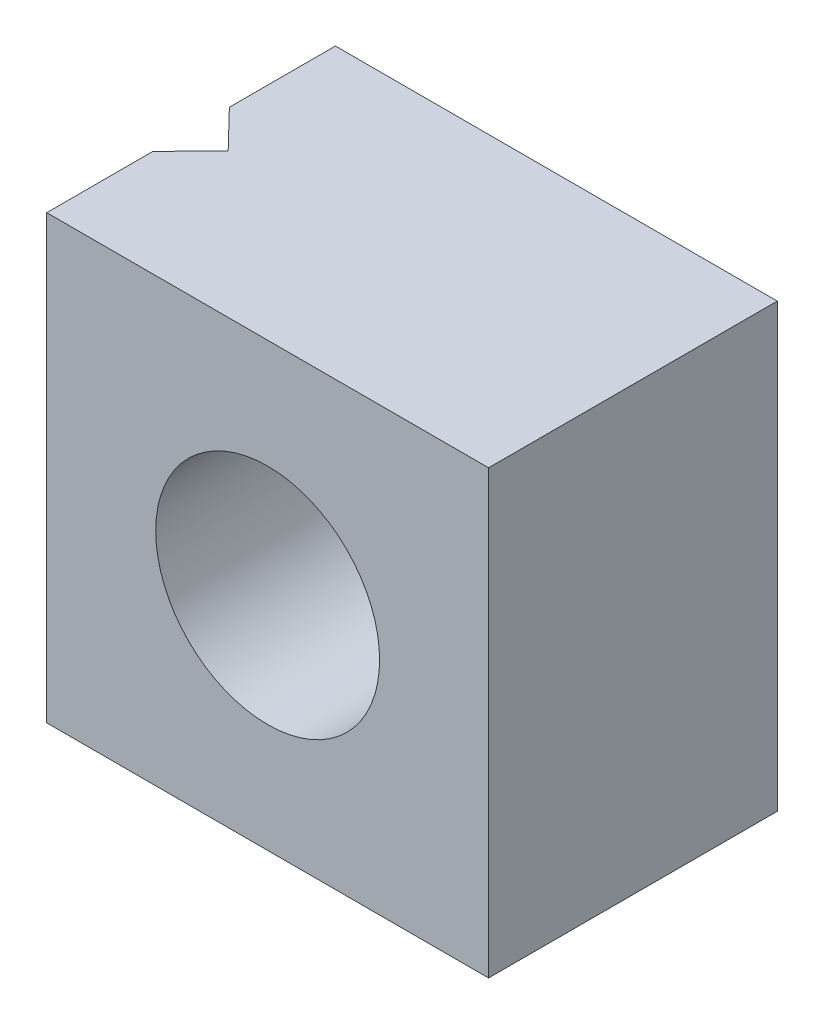
ISO-10303-21;
HEADER;
FILE_DESCRIPTION(('STEP AP214'),'2;1');
FILE_NAME('part.step','',(''),(''),'','','');
FILE_SCHEMA(('AUTOMOTIVE_DESIGN { 1 0 10303 214 1 1 1 1 }'));
ENDSEC;
DATA;
#1=APPLICATION_CONTEXT('core data for automotive mechanical design processes');
#2=APPLICATION_PROTOCOL_DEFINITION('international standard','automotive_design',2000,#1);
#3=PRODUCT_CONTEXT('',#1,'mechanical');
#4=PRODUCT('Part','Part','',(#3));
#5=PRODUCT_RELATED_PRODUCT_CATEGORY('part','',(#4));
#6=PRODUCT_DEFINITION_FORMATION('','',#4);
#7=PRODUCT_DEFINITION_CONTEXT('part definition',#1,'design');
#8=PRODUCT_DEFINITION('design','',#6,#7);
#9=PRODUCT_DEFINITION_SHAPE('','',#8);
#10=(LENGTH_UNIT() NAMED_UNIT(*) SI_UNIT(.MILLI.,.METRE.));
#11=(NAMED_UNIT(*) PLANE_ANGLE_UNIT() SI_UNIT($,.RADIAN.));
#12=(NAMED_UNIT(*) SI_UNIT($,.STERADIAN.) SOLID_ANGLE_UNIT());
#13=UNCERTAINTY_MEASURE_WITH_UNIT(LENGTH_MEASURE(1.E-05),#10,'distance_accuracy_value','');
#14=(GEOMETRIC_REPRESENTATION_CONTEXT(3) GLOBAL_UNCERTAINTY_ASSIGNED_CONTEXT((#13)) GLOBAL_UNIT_ASSIGNED_CONTEXT((#10,
#11,#12)) REPRESENTATION_CONTEXT('',''));
#15=CARTESIAN_POINT('',(0.,0.,0.));
#16=DIRECTION('',(0.,0.,1.));
#17=DIRECTION('',(1.,0.,0.));
#18=AXIS2_PLACEMENT_3D('',#15,#16,#17);
#19=CARTESIAN_POINT('',(0.,0.,-12.446));
#20=DIRECTION('',(-1.,0.,0.));
#21=DIRECTION('',(0.,0.,1.));
#22=AXIS2_PLACEMENT_3D('',#19,#20,#21);
#23=PLANE('',#22);
#24=DIRECTION('',(0.,0.,1.));
#25=VECTOR('',#24,1.);
#26=CARTESIAN_POINT('',(0.,0.,-12.446));
#27=LINE('',#26,#25);
#28=CARTESIAN_POINT('',(0.,0.,-4.572));
#29=VERTEX_POINT('',#28);
#30=CARTESIAN_POINT('',(0.,0.,0.));
#31=VERTEX_POINT('',#30);
#32=EDGE_CURVE('E78',#29,#31,#27,.T.);
#33=ORIENTED_EDGE('',*,*,#32,.F.);
#34=DIRECTION('',(0.,-1.,0.));
#35=VECTOR('',#34,1.);
#36=CARTESIAN_POINT('',(0.,37.0959043392933,-4.572));
#37=LINE('',#36,#35);
#38=CARTESIAN_POINT('',(0.,-19.05,-4.572));
#39=VERTEX_POINT('',#38);
#40=EDGE_CURVE('E107',#29,#39,#37,.T.);
#41=ORIENTED_EDGE('',*,*,#40,.T.);
#42=DIRECTION('',(0.,0.,1.));
#43=VECTOR('',#42,1.);
#44=CARTESIAN_POINT('',(0.,-19.05,-12.446));
#45=LINE('',#44,#43);
#46=CARTESIAN_POINT('',(0.,-19.05,0.));
#47=VERTEX_POINT('',#46);
#48=EDGE_CURVE('E135',#39,#47,#45,.T.);
#49=ORIENTED_EDGE('',*,*,#48,.T.);
#50=DIRECTION('',(0.,-1.,0.));
#51=VECTOR('',#50,1.);
#52=CARTESIAN_POINT('',(0.,0.,0.));
#53=LINE('',#52,#51);
#54=EDGE_CURVE('E122',#31,#47,#53,.T.);
#55=ORIENTED_EDGE('',*,*,#54,.F.);
#56=EDGE_LOOP('',(#33,#41,#49,#55));
#57=FACE_BOUND('',#56,.T.);
#58=ADVANCED_FACE('F33',(#57),#23,.T.);
#59=CARTESIAN_POINT('',(0.,-19.05,-12.446));
#60=VERTEX_POINT('',#59);
#61=CARTESIAN_POINT('',(0.,-19.05,-7.874));
#62=VERTEX_POINT('',#61);
#63=EDGE_CURVE('E85',#60,#62,#45,.T.);
#64=ORIENTED_EDGE('',*,*,#63,.T.);
#65=DIRECTION('',(0.,-1.,0.));
#66=VECTOR('',#65,1.);
#67=CARTESIAN_POINT('',(0.,37.0959043392933,-7.874));
#68=LINE('',#67,#66);
#69=CARTESIAN_POINT('',(0.,0.,-7.874));
#70=VERTEX_POINT('',#69);
#71=EDGE_CURVE('E47',#70,#62,#68,.T.);
#72=ORIENTED_EDGE('',*,*,#71,.F.);
#73=CARTESIAN_POINT('',(0.,0.,-12.446));
#74=VERTEX_POINT('',#73);
#75=EDGE_CURVE('E55',#74,#70,#27,.T.);
#76=ORIENTED_EDGE('',*,*,#75,.F.);
#77=DIRECTION('',(0.,-1.,0.));
#78=VECTOR('',#77,1.);
#79=CARTESIAN_POINT('',(0.,0.,-12.446));
#80=LINE('',#79,#78);
#81=EDGE_CURVE('E125',#74,#60,#80,.T.);
#82=ORIENTED_EDGE('',*,*,#81,.T.);
#83=EDGE_LOOP('',(#64,#72,#76,#82));
#84=FACE_BOUND('',#83,.T.);
#85=ADVANCED_FACE('F153',(#84),#23,.T.);
#86=CARTESIAN_POINT('',(0.,0.,-12.446));
#87=DIRECTION('',(0.,1.,0.));
#88=DIRECTION('',(0.,0.,1.));
#89=AXIS2_PLACEMENT_3D('',#86,#87,#88);
#90=PLANE('',#89);
#91=DIRECTION('',(0.695973285238859,0.,0.718067675246442));
#92=VECTOR('',#91,1.);
#93=CARTESIAN_POINT('',(-2.28488406150842,0.,-10.2314200634611));
#94=LINE('',#93,#92);
#95=CARTESIAN_POINT('',(1.6002,0.,-6.223));
#96=VERTEX_POINT('',#95);
#97=EDGE_CURVE('E110',#70,#96,#94,.T.);
#98=ORIENTED_EDGE('',*,*,#97,.T.);
#99=DIRECTION('',(-0.69597328523886,0.,0.718067675246442));
#100=VECTOR('',#99,1.);
#101=CARTESIAN_POINT('',(3.93507810593117,0.,-8.63200122040517));
#102=LINE('',#101,#100);
#103=EDGE_CURVE('E102',#96,#29,#102,.T.);
#104=ORIENTED_EDGE('',*,*,#103,.T.);
#105=ORIENTED_EDGE('',*,*,#32,.T.);
#106=DIRECTION('',(-1.,0.,0.));
#107=VECTOR('',#106,1.);
#108=CARTESIAN_POINT('',(0.,0.,0.));
#109=LINE('',#108,#107);
#110=CARTESIAN_POINT('',(19.05,0.,0.));
#111=VERTEX_POINT('',#110);
#112=EDGE_CURVE('E128',#111,#31,#109,.T.);
#113=ORIENTED_EDGE('',*,*,#112,.F.);
#114=DIRECTION('',(0.,0.,1.));
#115=VECTOR('',#114,1.);
#116=CARTESIAN_POINT('',(19.05,0.,-12.446));
#117=LINE('',#116,#115);
#118=CARTESIAN_POINT('',(19.05,0.,-12.446));
#119=VERTEX_POINT('',#118);
#120=EDGE_CURVE('E147',#119,#111,#117,.T.);
#121=ORIENTED_EDGE('',*,*,#120,.F.);
#122=DIRECTION('',(-1.,0.,0.));
#123=VECTOR('',#122,1.);
#124=CARTESIAN_POINT('',(0.,0.,-12.446));
#125=LINE('',#124,#123);
#126=EDGE_CURVE('E133',#119,#74,#125,.T.);
#127=ORIENTED_EDGE('',*,*,#126,.T.);
#128=ORIENTED_EDGE('',*,*,#75,.T.);
#129=EDGE_LOOP('',(#98,#104,#105,#113,#121,#127,#128));
#130=FACE_BOUND('',#129,.T.);
#131=ADVANCED_FACE('F114',(#130),#90,.T.);
#132=CARTESIAN_POINT('',(0.,-19.05,-12.446));
#133=DIRECTION('',(0.,-1.,0.));
#134=DIRECTION('',(0.,0.,-1.));
#135=AXIS2_PLACEMENT_3D('',#132,#133,#134);
#136=PLANE('',#135);
#137=ORIENTED_EDGE('',*,*,#48,.F.);
#138=DIRECTION('',(0.69597328523886,0.,-0.718067675246442));
#139=VECTOR('',#138,1.);
#140=CARTESIAN_POINT('',(3.93507810593117,-19.05,-8.63200122040517));
#141=LINE('',#140,#139);
#142=CARTESIAN_POINT('',(1.6002,-19.05,-6.223));
#143=VERTEX_POINT('',#142);
#144=EDGE_CURVE('E11',#39,#143,#141,.T.);
#145=ORIENTED_EDGE('',*,*,#144,.T.);
#146=DIRECTION('',(-0.695973285238859,0.,-0.718067675246442));
#147=VECTOR('',#146,1.);
#148=CARTESIAN_POINT('',(-2.28488406150842,-19.05,-10.2314200634611));
#149=LINE('',#148,#147);
#150=EDGE_CURVE('E40',#143,#62,#149,.T.);
#151=ORIENTED_EDGE('',*,*,#150,.T.);
#152=ORIENTED_EDGE('',*,*,#63,.F.);
#153=DIRECTION('',(1.,0.,0.));
#154=VECTOR('',#153,1.);
#155=CARTESIAN_POINT('',(0.,-19.05,-12.446));
#156=LINE('',#155,#154);
#157=CARTESIAN_POINT('',(19.05,-19.05,-12.446));
#158=VERTEX_POINT('',#157);
#159=EDGE_CURVE('E127',#60,#158,#156,.T.);
#160=ORIENTED_EDGE('',*,*,#159,.T.);
#161=DIRECTION('',(0.,0.,1.));
#162=VECTOR('',#161,1.);
#163=CARTESIAN_POINT('',(19.05,-19.05,-12.446));
#164=LINE('',#163,#162);
#165=CARTESIAN_POINT('',(19.05,-19.05,0.));
#166=VERTEX_POINT('',#165);
#167=EDGE_CURVE('E149',#158,#166,#164,.T.);
#168=ORIENTED_EDGE('',*,*,#167,.T.);
#169=DIRECTION('',(1.,0.,0.));
#170=VECTOR('',#169,1.);
#171=CARTESIAN_POINT('',(0.,-19.05,0.));
#172=LINE('',#171,#170);
#173=EDGE_CURVE('E138',#47,#166,#172,.T.);
#174=ORIENTED_EDGE('',*,*,#173,.F.);
#175=EDGE_LOOP('',(#137,#145,#151,#152,#160,#168,#174));
#176=FACE_BOUND('',#175,.T.);
#177=ADVANCED_FACE('F152',(#176),#136,.T.);
#178=CARTESIAN_POINT('',(19.05,0.,-12.446));
#179=DIRECTION('',(1.,0.,0.));
#180=DIRECTION('',(0.,1.,0.));
#181=AXIS2_PLACEMENT_3D('',#178,#179,#180);
#182=PLANE('',#181);
#183=DIRECTION('',(0.,1.,0.));
#184=VECTOR('',#183,1.);
#185=CARTESIAN_POINT('',(19.05,0.,0.));
#186=LINE('',#185,#184);
#187=EDGE_CURVE('E141',#166,#111,#186,.T.);
#188=ORIENTED_EDGE('',*,*,#187,.F.);
#189=ORIENTED_EDGE('',*,*,#167,.F.);
#190=DIRECTION('',(0.,1.,0.));
#191=VECTOR('',#190,1.);
#192=CARTESIAN_POINT('',(19.05,0.,-12.446));
#193=LINE('',#192,#191);
#194=EDGE_CURVE('E130',#158,#119,#193,.T.);
#195=ORIENTED_EDGE('',*,*,#194,.T.);
#196=ORIENTED_EDGE('',*,*,#120,.T.);
#197=EDGE_LOOP('',(#188,#189,#195,#196));
#198=FACE_BOUND('',#197,.T.);
#199=ADVANCED_FACE('F160',(#198),#182,.T.);
#200=CARTESIAN_POINT('',(0.,0.,-12.446));
#201=DIRECTION('',(0.,0.,1.));
#202=DIRECTION('',(1.,0.,0.));
#203=AXIS2_PLACEMENT_3D('',#200,#201,#202);
#204=PLANE('',#203);
#205=CARTESIAN_POINT('',(9.525,-9.525,-12.446));
#206=DIRECTION('',(0.,0.,1.));
#207=DIRECTION('',(1.,0.,0.));
#208=AXIS2_PLACEMENT_3D('',#205,#206,#207);
#209=CIRCLE('',#208,4.826);
#210=CARTESIAN_POINT('',(14.351,-9.525,-12.446));
#211=VERTEX_POINT('',#210);
#212=EDGE_CURVE('E119',#211,#211,#209,.T.);
#213=ORIENTED_EDGE('',*,*,#212,.T.);
#214=EDGE_LOOP('',(#213));
#215=FACE_BOUND('',#214,.T.);
#216=ORIENTED_EDGE('',*,*,#81,.F.);
#217=ORIENTED_EDGE('',*,*,#126,.F.);
#218=ORIENTED_EDGE('',*,*,#194,.F.);
#219=ORIENTED_EDGE('',*,*,#159,.F.);
#220=EDGE_LOOP('',(#216,#217,#218,#219));
#221=FACE_BOUND('',#220,.T.);
#222=ADVANCED_FACE('F156',(#215,#221),#204,.F.);
#223=CARTESIAN_POINT('',(0.,0.,0.));
#224=DIRECTION('',(0.,0.,1.));
#225=DIRECTION('',(1.,0.,0.));
#226=AXIS2_PLACEMENT_3D('',#223,#224,#225);
#227=PLANE('',#226);
#228=CARTESIAN_POINT('',(9.525,-9.525,0.));
#229=DIRECTION('',(0.,0.,1.));
#230=DIRECTION('',(1.,0.,0.));
#231=AXIS2_PLACEMENT_3D('',#228,#229,#230);
#232=CIRCLE('',#231,4.826);
#233=CARTESIAN_POINT('',(14.351,-9.525,0.));
#234=VERTEX_POINT('',#233);
#235=EDGE_CURVE('E109',#234,#234,#232,.T.);
#236=ORIENTED_EDGE('',*,*,#235,.F.);
#237=EDGE_LOOP('',(#236));
#238=FACE_BOUND('',#237,.T.);
#239=ORIENTED_EDGE('',*,*,#54,.T.);
#240=ORIENTED_EDGE('',*,*,#173,.T.);
#241=ORIENTED_EDGE('',*,*,#187,.T.);
#242=ORIENTED_EDGE('',*,*,#112,.T.);
#243=EDGE_LOOP('',(#239,#240,#241,#242));
#244=FACE_BOUND('',#243,.T.);
#245=ADVANCED_FACE('F163',(#238,#244),#227,.T.);
#246=CARTESIAN_POINT('',(9.525,-9.525,-12.446));
#247=DIRECTION('',(0.,0.,1.));
#248=DIRECTION('',(1.,0.,0.));
#249=AXIS2_PLACEMENT_3D('',#246,#247,#248);
#250=CYLINDRICAL_SURFACE('',#249,4.826);
#251=ORIENTED_EDGE('',*,*,#212,.F.);
#252=EDGE_LOOP('',(#251));
#253=FACE_BOUND('',#252,.T.);
#254=ORIENTED_EDGE('',*,*,#235,.T.);
#255=EDGE_LOOP('',(#254));
#256=FACE_BOUND('',#255,.T.);
#257=ADVANCED_FACE('F187',(#253,#256),#250,.F.);
#258=CARTESIAN_POINT('',(0.,37.0959043392933,-4.572));
#259=DIRECTION('',(-0.718067675246442,0.,-0.69597328523886));
#260=DIRECTION('',(-0.69597328523886,0.,0.718067675246442));
#261=AXIS2_PLACEMENT_3D('',#258,#259,#260);
#262=PLANE('',#261);
#263=ORIENTED_EDGE('',*,*,#103,.F.);
#264=DIRECTION('',(0.,-1.,0.));
#265=VECTOR('',#264,1.);
#266=CARTESIAN_POINT('',(1.6002,37.0959043392933,-6.223));
#267=LINE('',#266,#265);
#268=EDGE_CURVE('E105',#96,#143,#267,.T.);
#269=ORIENTED_EDGE('',*,*,#268,.T.);
#270=ORIENTED_EDGE('',*,*,#144,.F.);
#271=ORIENTED_EDGE('',*,*,#40,.F.);
#272=EDGE_LOOP('',(#263,#269,#270,#271));
#273=FACE_BOUND('',#272,.T.);
#274=ADVANCED_FACE('F104',(#273),#262,.T.);
#275=CARTESIAN_POINT('',(1.6002,37.0959043392933,-6.223));
#276=DIRECTION('',(-0.718067675246442,0.,0.695973285238859));
#277=DIRECTION('',(0.695973285238859,0.,0.718067675246442));
#278=AXIS2_PLACEMENT_3D('',#275,#276,#277);
#279=PLANE('',#278);
#280=ORIENTED_EDGE('',*,*,#97,.F.);
#281=ORIENTED_EDGE('',*,*,#71,.T.);
#282=ORIENTED_EDGE('',*,*,#150,.F.);
#283=ORIENTED_EDGE('',*,*,#268,.F.);
#284=EDGE_LOOP('',(#280,#281,#282,#283));
#285=FACE_BOUND('',#284,.T.);
#286=ADVANCED_FACE('F112',(#285),#279,.T.);
#287=CLOSED_SHELL('',(#58,#85,#131,#177,#199,#222,#245,#257,#274,#286));
#288=MANIFOLD_SOLID_BREP('B2',#287);
#289=ADVANCED_BREP_SHAPE_REPRESENTATION('',(#18,#288),#14);
#290=SHAPE_DEFINITION_REPRESENTATION(#9,#289);
ENDSEC;
END-ISO-10303-21;
